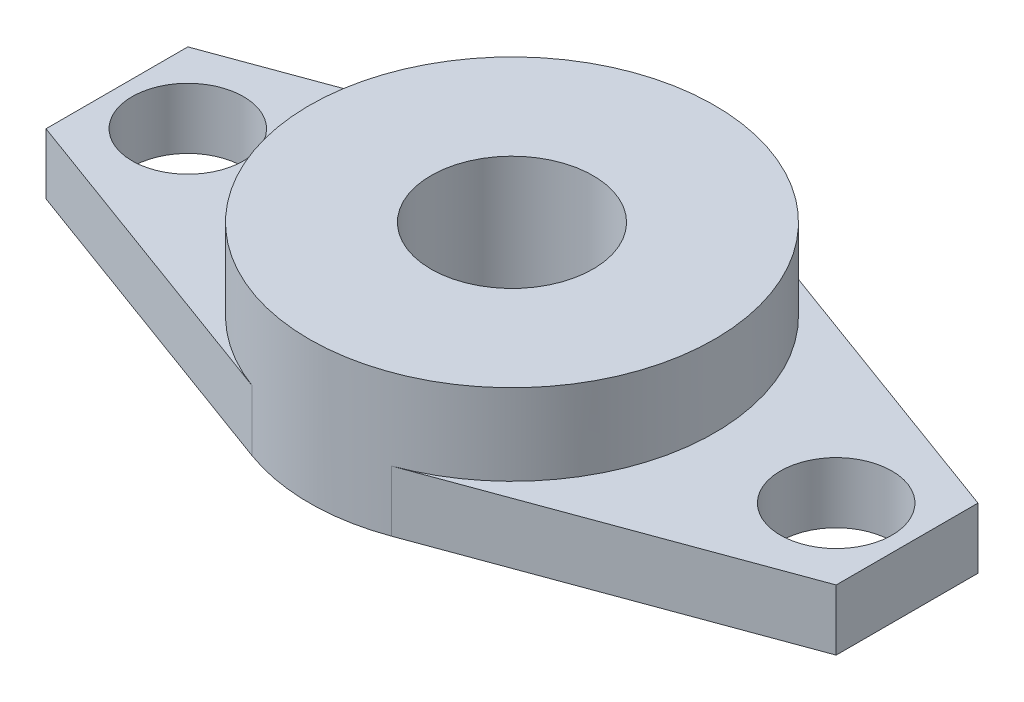
ISO-10303-21;
HEADER;
FILE_DESCRIPTION(('STEP AP214'),'2;1');
FILE_NAME('part.step','',(''),(''),'','','');
FILE_SCHEMA(('AUTOMOTIVE_DESIGN { 1 0 10303 214 1 1 1 1 }'));
ENDSEC;
DATA;
#1=APPLICATION_CONTEXT('core data for automotive mechanical design processes');
#2=APPLICATION_PROTOCOL_DEFINITION('international standard','automotive_design',2000,#1);
#3=PRODUCT_CONTEXT('',#1,'mechanical');
#4=PRODUCT('Part','Part','',(#3));
#5=PRODUCT_RELATED_PRODUCT_CATEGORY('part','',(#4));
#6=PRODUCT_DEFINITION_FORMATION('','',#4);
#7=PRODUCT_DEFINITION_CONTEXT('part definition',#1,'design');
#8=PRODUCT_DEFINITION('design','',#6,#7);
#9=PRODUCT_DEFINITION_SHAPE('','',#8);
#10=(LENGTH_UNIT() NAMED_UNIT(*) SI_UNIT(.MILLI.,.METRE.));
#11=(NAMED_UNIT(*) PLANE_ANGLE_UNIT() SI_UNIT($,.RADIAN.));
#12=(NAMED_UNIT(*) SI_UNIT($,.STERADIAN.) SOLID_ANGLE_UNIT());
#13=UNCERTAINTY_MEASURE_WITH_UNIT(LENGTH_MEASURE(1.E-05),#10,'distance_accuracy_value','');
#14=(GEOMETRIC_REPRESENTATION_CONTEXT(3) GLOBAL_UNCERTAINTY_ASSIGNED_CONTEXT((#13)) GLOBAL_UNIT_ASSIGNED_CONTEXT((#10,
#11,#12)) REPRESENTATION_CONTEXT('',''));
#15=CARTESIAN_POINT('',(0.,0.,0.));
#16=DIRECTION('',(0.,0.,1.));
#17=DIRECTION('',(1.,0.,0.));
#18=AXIS2_PLACEMENT_3D('',#15,#16,#17);
#19=CARTESIAN_POINT('',(0.,3.,0.));
#20=DIRECTION('',(0.,1.,0.));
#21=DIRECTION('',(0.,0.,1.));
#22=AXIS2_PLACEMENT_3D('',#19,#20,#21);
#23=PLANE('',#22);
#24=CARTESIAN_POINT('',(0.,3.,0.));
#25=DIRECTION('',(0.,1.,0.));
#26=DIRECTION('',(0.,0.,1.));
#27=AXIS2_PLACEMENT_3D('',#24,#25,#26);
#28=CIRCLE('',#27,10.);
#29=CARTESIAN_POINT('',(3.44307745687376,3.,9.38856845456046));
#30=VERTEX_POINT('',#29);
#31=CARTESIAN_POINT('',(3.44307745687376,3.,-9.38856845456046));
#32=VERTEX_POINT('',#31);
#33=EDGE_CURVE('E45',#30,#32,#28,.T.);
#34=ORIENTED_EDGE('',*,*,#33,.F.);
#35=DIRECTION('',(0.938856845456046,0.,-0.344307745687376));
#36=VECTOR('',#35,1.);
#37=CARTESIAN_POINT('',(19.5,3.,3.5));
#38=LINE('',#37,#36);
#39=CARTESIAN_POINT('',(19.5,3.,3.5));
#40=VERTEX_POINT('',#39);
#41=EDGE_CURVE('E175',#30,#40,#38,.T.);
#42=ORIENTED_EDGE('',*,*,#41,.T.);
#43=DIRECTION('',(0.,0.,-1.));
#44=VECTOR('',#43,1.);
#45=CARTESIAN_POINT('',(19.5,3.,-3.5));
#46=LINE('',#45,#44);
#47=CARTESIAN_POINT('',(19.5,3.,-3.5));
#48=VERTEX_POINT('',#47);
#49=EDGE_CURVE('E127',#40,#48,#46,.T.);
#50=ORIENTED_EDGE('',*,*,#49,.T.);
#51=DIRECTION('',(-0.938856845456046,0.,-0.344307745687376));
#52=VECTOR('',#51,1.);
#53=CARTESIAN_POINT('',(19.5,3.,-3.5));
#54=LINE('',#53,#52);
#55=EDGE_CURVE('E123',#48,#32,#54,.T.);
#56=ORIENTED_EDGE('',*,*,#55,.T.);
#57=EDGE_LOOP('',(#34,#42,#50,#56));
#58=FACE_BOUND('',#57,.T.);
#59=CARTESIAN_POINT('',(16.,3.,0.));
#60=DIRECTION('',(0.,1.,0.));
#61=DIRECTION('',(0.,0.,-1.));
#62=AXIS2_PLACEMENT_3D('',#59,#60,#61);
#63=CIRCLE('',#62,2.75);
#64=CARTESIAN_POINT('',(16.,3.,-2.75));
#65=VERTEX_POINT('',#64);
#66=EDGE_CURVE('E187',#65,#65,#63,.T.);
#67=ORIENTED_EDGE('',*,*,#66,.F.);
#68=EDGE_LOOP('',(#67));
#69=FACE_BOUND('',#68,.T.);
#70=ADVANCED_FACE('F34',(#58,#69),#23,.T.);
#71=CARTESIAN_POINT('',(-3.44307745687376,3.,-9.38856845456046));
#72=VERTEX_POINT('',#71);
#73=CARTESIAN_POINT('',(-3.44307745687376,3.,9.38856845456045));
#74=VERTEX_POINT('',#73);
#75=EDGE_CURVE('E11',#72,#74,#28,.T.);
#76=ORIENTED_EDGE('',*,*,#75,.F.);
#77=DIRECTION('',(-0.938856845456046,0.,0.344307745687376));
#78=VECTOR('',#77,1.);
#79=CARTESIAN_POINT('',(-19.5,3.,-3.5));
#80=LINE('',#79,#78);
#81=CARTESIAN_POINT('',(-19.5,3.,-3.5));
#82=VERTEX_POINT('',#81);
#83=EDGE_CURVE('E110',#72,#82,#80,.T.);
#84=ORIENTED_EDGE('',*,*,#83,.T.);
#85=DIRECTION('',(0.,0.,1.));
#86=VECTOR('',#85,1.);
#87=CARTESIAN_POINT('',(-19.5,3.,-3.5));
#88=LINE('',#87,#86);
#89=CARTESIAN_POINT('',(-19.5,3.,3.5));
#90=VERTEX_POINT('',#89);
#91=EDGE_CURVE('E53',#82,#90,#88,.T.);
#92=ORIENTED_EDGE('',*,*,#91,.T.);
#93=DIRECTION('',(0.938856845456046,0.,0.344307745687376));
#94=VECTOR('',#93,1.);
#95=CARTESIAN_POINT('',(-19.5,3.,3.5));
#96=LINE('',#95,#94);
#97=EDGE_CURVE('E95',#90,#74,#96,.T.);
#98=ORIENTED_EDGE('',*,*,#97,.T.);
#99=EDGE_LOOP('',(#76,#84,#92,#98));
#100=FACE_BOUND('',#99,.T.);
#101=CARTESIAN_POINT('',(-16.,3.,0.));
#102=DIRECTION('',(0.,1.,0.));
#103=DIRECTION('',(0.,0.,1.));
#104=AXIS2_PLACEMENT_3D('',#101,#102,#103);
#105=CIRCLE('',#104,2.75);
#106=CARTESIAN_POINT('',(-16.,3.,2.75));
#107=VERTEX_POINT('',#106);
#108=EDGE_CURVE('E135',#107,#107,#105,.T.);
#109=ORIENTED_EDGE('',*,*,#108,.F.);
#110=EDGE_LOOP('',(#109));
#111=FACE_BOUND('',#110,.T.);
#112=ADVANCED_FACE('F107',(#100,#111),#23,.T.);
#113=CARTESIAN_POINT('',(0.,0.,0.));
#114=DIRECTION('',(0.,1.,0.));
#115=DIRECTION('',(0.,0.,1.));
#116=AXIS2_PLACEMENT_3D('',#113,#114,#115);
#117=PLANE('',#116);
#118=DIRECTION('',(0.938856845456046,0.,0.344307745687376));
#119=VECTOR('',#118,1.);
#120=CARTESIAN_POINT('',(-19.5,0.,3.5));
#121=LINE('',#120,#119);
#122=CARTESIAN_POINT('',(-19.5,0.,3.5));
#123=VERTEX_POINT('',#122);
#124=CARTESIAN_POINT('',(-3.44307745687376,0.,9.38856845456045));
#125=VERTEX_POINT('',#124);
#126=EDGE_CURVE('E131',#123,#125,#121,.T.);
#127=ORIENTED_EDGE('',*,*,#126,.F.);
#128=DIRECTION('',(0.,0.,1.));
#129=VECTOR('',#128,1.);
#130=CARTESIAN_POINT('',(-19.5,0.,-3.5));
#131=LINE('',#130,#129);
#132=CARTESIAN_POINT('',(-19.5,0.,-3.5));
#133=VERTEX_POINT('',#132);
#134=EDGE_CURVE('E89',#133,#123,#131,.T.);
#135=ORIENTED_EDGE('',*,*,#134,.F.);
#136=DIRECTION('',(-0.938856845456046,0.,0.344307745687376));
#137=VECTOR('',#136,1.);
#138=CARTESIAN_POINT('',(-19.5,0.,-3.5));
#139=LINE('',#138,#137);
#140=CARTESIAN_POINT('',(-3.44307745687376,0.,-9.38856845456046));
#141=VERTEX_POINT('',#140);
#142=EDGE_CURVE('E83',#141,#133,#139,.T.);
#143=ORIENTED_EDGE('',*,*,#142,.F.);
#144=CARTESIAN_POINT('',(0.,0.,0.));
#145=DIRECTION('',(0.,1.,0.));
#146=DIRECTION('',(0.,0.,-1.));
#147=AXIS2_PLACEMENT_3D('',#144,#145,#146);
#148=CIRCLE('',#147,10.);
#149=CARTESIAN_POINT('',(3.44307745687376,0.,-9.38856845456046));
#150=VERTEX_POINT('',#149);
#151=EDGE_CURVE('E118',#150,#141,#148,.T.);
#152=ORIENTED_EDGE('',*,*,#151,.F.);
#153=DIRECTION('',(-0.938856845456046,0.,-0.344307745687376));
#154=VECTOR('',#153,1.);
#155=CARTESIAN_POINT('',(19.5,0.,-3.5));
#156=LINE('',#155,#154);
#157=CARTESIAN_POINT('',(19.5,0.,-3.5));
#158=VERTEX_POINT('',#157);
#159=EDGE_CURVE('E141',#158,#150,#156,.T.);
#160=ORIENTED_EDGE('',*,*,#159,.F.);
#161=DIRECTION('',(0.,0.,-1.));
#162=VECTOR('',#161,1.);
#163=CARTESIAN_POINT('',(19.5,0.,-3.5));
#164=LINE('',#163,#162);
#165=CARTESIAN_POINT('',(19.5,0.,3.5));
#166=VERTEX_POINT('',#165);
#167=EDGE_CURVE('E139',#166,#158,#164,.T.);
#168=ORIENTED_EDGE('',*,*,#167,.F.);
#169=DIRECTION('',(0.938856845456046,0.,-0.344307745687376));
#170=VECTOR('',#169,1.);
#171=CARTESIAN_POINT('',(19.5,0.,3.5));
#172=LINE('',#171,#170);
#173=CARTESIAN_POINT('',(3.44307745687376,0.,9.38856845456046));
#174=VERTEX_POINT('',#173);
#175=EDGE_CURVE('E137',#174,#166,#172,.T.);
#176=ORIENTED_EDGE('',*,*,#175,.F.);
#177=CARTESIAN_POINT('',(0.,0.,0.));
#178=DIRECTION('',(0.,1.,0.));
#179=DIRECTION('',(0.,0.,1.));
#180=AXIS2_PLACEMENT_3D('',#177,#178,#179);
#181=CIRCLE('',#180,10.);
#182=EDGE_CURVE('E134',#125,#174,#181,.T.);
#183=ORIENTED_EDGE('',*,*,#182,.F.);
#184=EDGE_LOOP('',(#127,#135,#143,#152,#160,#168,#176,#183));
#185=FACE_BOUND('',#184,.T.);
#186=CARTESIAN_POINT('',(-16.,0.,0.));
#187=DIRECTION('',(0.,1.,0.));
#188=DIRECTION('',(0.,0.,1.));
#189=AXIS2_PLACEMENT_3D('',#186,#187,#188);
#190=CIRCLE('',#189,2.75);
#191=CARTESIAN_POINT('',(-16.,0.,2.75));
#192=VERTEX_POINT('',#191);
#193=EDGE_CURVE('E179',#192,#192,#190,.T.);
#194=ORIENTED_EDGE('',*,*,#193,.T.);
#195=EDGE_LOOP('',(#194));
#196=FACE_BOUND('',#195,.T.);
#197=CARTESIAN_POINT('',(0.,0.,0.));
#198=DIRECTION('',(0.,1.,0.));
#199=DIRECTION('',(0.,0.,1.));
#200=AXIS2_PLACEMENT_3D('',#197,#198,#199);
#201=CIRCLE('',#200,4.);
#202=CARTESIAN_POINT('',(0.,0.,4.));
#203=VERTEX_POINT('',#202);
#204=EDGE_CURVE('E182',#203,#203,#201,.T.);
#205=ORIENTED_EDGE('',*,*,#204,.T.);
#206=EDGE_LOOP('',(#205));
#207=FACE_BOUND('',#206,.T.);
#208=CARTESIAN_POINT('',(16.,0.,0.));
#209=DIRECTION('',(0.,1.,0.));
#210=DIRECTION('',(0.,0.,-1.));
#211=AXIS2_PLACEMENT_3D('',#208,#209,#210);
#212=CIRCLE('',#211,2.75);
#213=CARTESIAN_POINT('',(16.,0.,-2.75));
#214=VERTEX_POINT('',#213);
#215=EDGE_CURVE('E188',#214,#214,#212,.T.);
#216=ORIENTED_EDGE('',*,*,#215,.T.);
#217=EDGE_LOOP('',(#216));
#218=FACE_BOUND('',#217,.T.);
#219=ADVANCED_FACE('F163',(#185,#196,#207,#218),#117,.F.);
#220=CARTESIAN_POINT('',(-19.5,3.,3.5));
#221=DIRECTION('',(0.344307745687376,0.,-0.938856845456046));
#222=DIRECTION('',(-0.938856845456046,0.,-0.344307745687376));
#223=AXIS2_PLACEMENT_3D('',#220,#221,#222);
#224=PLANE('',#223);
#225=ORIENTED_EDGE('',*,*,#126,.T.);
#226=DIRECTION('',(0.,-1.,0.));
#227=VECTOR('',#226,1.);
#228=CARTESIAN_POINT('',(-3.44307745687376,3.,9.38856845456045));
#229=LINE('',#228,#227);
#230=EDGE_CURVE('E38',#74,#125,#229,.T.);
#231=ORIENTED_EDGE('',*,*,#230,.F.);
#232=ORIENTED_EDGE('',*,*,#97,.F.);
#233=DIRECTION('',(0.,-1.,0.));
#234=VECTOR('',#233,1.);
#235=CARTESIAN_POINT('',(-19.5,3.,3.5));
#236=LINE('',#235,#234);
#237=EDGE_CURVE('E125',#90,#123,#236,.T.);
#238=ORIENTED_EDGE('',*,*,#237,.T.);
#239=EDGE_LOOP('',(#225,#231,#232,#238));
#240=FACE_BOUND('',#239,.T.);
#241=ADVANCED_FACE('F36',(#240),#224,.F.);
#242=CARTESIAN_POINT('',(19.5,3.,3.5));
#243=DIRECTION('',(-0.344307745687376,0.,-0.938856845456046));
#244=DIRECTION('',(-0.938856845456046,0.,0.344307745687376));
#245=AXIS2_PLACEMENT_3D('',#242,#243,#244);
#246=PLANE('',#245);
#247=ORIENTED_EDGE('',*,*,#175,.T.);
#248=DIRECTION('',(0.,-1.,0.));
#249=VECTOR('',#248,1.);
#250=CARTESIAN_POINT('',(19.5,3.,3.5));
#251=LINE('',#250,#249);
#252=EDGE_CURVE('E152',#40,#166,#251,.T.);
#253=ORIENTED_EDGE('',*,*,#252,.F.);
#254=ORIENTED_EDGE('',*,*,#41,.F.);
#255=DIRECTION('',(0.,-1.,0.));
#256=VECTOR('',#255,1.);
#257=CARTESIAN_POINT('',(3.44307745687376,3.,9.38856845456046));
#258=LINE('',#257,#256);
#259=EDGE_CURVE('E154',#30,#174,#258,.T.);
#260=ORIENTED_EDGE('',*,*,#259,.T.);
#261=EDGE_LOOP('',(#247,#253,#254,#260));
#262=FACE_BOUND('',#261,.T.);
#263=ADVANCED_FACE('F168',(#262),#246,.F.);
#264=CARTESIAN_POINT('',(19.5,3.,-3.5));
#265=DIRECTION('',(-1.,0.,0.));
#266=DIRECTION('',(0.,0.,1.));
#267=AXIS2_PLACEMENT_3D('',#264,#265,#266);
#268=PLANE('',#267);
#269=ORIENTED_EDGE('',*,*,#167,.T.);
#270=DIRECTION('',(0.,-1.,0.));
#271=VECTOR('',#270,1.);
#272=CARTESIAN_POINT('',(19.5,3.,-3.5));
#273=LINE('',#272,#271);
#274=EDGE_CURVE('E149',#48,#158,#273,.T.);
#275=ORIENTED_EDGE('',*,*,#274,.F.);
#276=ORIENTED_EDGE('',*,*,#49,.F.);
#277=ORIENTED_EDGE('',*,*,#252,.T.);
#278=EDGE_LOOP('',(#269,#275,#276,#277));
#279=FACE_BOUND('',#278,.T.);
#280=ADVANCED_FACE('F171',(#279),#268,.F.);
#281=CARTESIAN_POINT('',(19.5,3.,-3.5));
#282=DIRECTION('',(-0.344307745687376,0.,0.938856845456046));
#283=DIRECTION('',(0.938856845456046,0.,0.344307745687376));
#284=AXIS2_PLACEMENT_3D('',#281,#282,#283);
#285=PLANE('',#284);
#286=ORIENTED_EDGE('',*,*,#159,.T.);
#287=DIRECTION('',(0.,-1.,0.));
#288=VECTOR('',#287,1.);
#289=CARTESIAN_POINT('',(3.44307745687376,3.,-9.38856845456046));
#290=LINE('',#289,#288);
#291=EDGE_CURVE('E119',#32,#150,#290,.T.);
#292=ORIENTED_EDGE('',*,*,#291,.F.);
#293=ORIENTED_EDGE('',*,*,#55,.F.);
#294=ORIENTED_EDGE('',*,*,#274,.T.);
#295=EDGE_LOOP('',(#286,#292,#293,#294));
#296=FACE_BOUND('',#295,.T.);
#297=ADVANCED_FACE('F233',(#296),#285,.F.);
#298=CARTESIAN_POINT('',(0.,3.,0.));
#299=DIRECTION('',(0.,-1.,0.));
#300=DIRECTION('',(0.,0.,-1.));
#301=AXIS2_PLACEMENT_3D('',#298,#299,#300);
#302=CYLINDRICAL_SURFACE('',#301,10.);
#303=ORIENTED_EDGE('',*,*,#151,.T.);
#304=DIRECTION('',(0.,-1.,0.));
#305=VECTOR('',#304,1.);
#306=CARTESIAN_POINT('',(-3.44307745687376,3.,-9.38856845456046));
#307=LINE('',#306,#305);
#308=EDGE_CURVE('E113',#72,#141,#307,.T.);
#309=ORIENTED_EDGE('',*,*,#308,.F.);
#310=ORIENTED_EDGE('',*,*,#75,.T.);
#311=ORIENTED_EDGE('',*,*,#230,.T.);
#312=ORIENTED_EDGE('',*,*,#182,.T.);
#313=ORIENTED_EDGE('',*,*,#259,.F.);
#314=ORIENTED_EDGE('',*,*,#33,.T.);
#315=ORIENTED_EDGE('',*,*,#291,.T.);
#316=EDGE_LOOP('',(#303,#309,#310,#311,#312,#313,#314,#315));
#317=FACE_BOUND('',#316,.T.);
#318=CARTESIAN_POINT('',(0.,7.,0.));
#319=DIRECTION('',(0.,1.,0.));
#320=DIRECTION('',(0.,0.,1.));
#321=AXIS2_PLACEMENT_3D('',#318,#319,#320);
#322=CIRCLE('',#321,10.);
#323=CARTESIAN_POINT('',(0.,7.,10.));
#324=VERTEX_POINT('',#323);
#325=EDGE_CURVE('E191',#324,#324,#322,.T.);
#326=ORIENTED_EDGE('',*,*,#325,.F.);
#327=EDGE_LOOP('',(#326));
#328=FACE_BOUND('',#327,.T.);
#329=ADVANCED_FACE('F114',(#317,#328),#302,.T.);
#330=CARTESIAN_POINT('',(-19.5,3.,-3.5));
#331=DIRECTION('',(0.344307745687376,0.,0.938856845456046));
#332=DIRECTION('',(0.938856845456046,0.,-0.344307745687376));
#333=AXIS2_PLACEMENT_3D('',#330,#331,#332);
#334=PLANE('',#333);
#335=ORIENTED_EDGE('',*,*,#142,.T.);
#336=DIRECTION('',(0.,-1.,0.));
#337=VECTOR('',#336,1.);
#338=CARTESIAN_POINT('',(-19.5,3.,-3.5));
#339=LINE('',#338,#337);
#340=EDGE_CURVE('E120',#82,#133,#339,.T.);
#341=ORIENTED_EDGE('',*,*,#340,.F.);
#342=ORIENTED_EDGE('',*,*,#83,.F.);
#343=ORIENTED_EDGE('',*,*,#308,.T.);
#344=EDGE_LOOP('',(#335,#341,#342,#343));
#345=FACE_BOUND('',#344,.T.);
#346=ADVANCED_FACE('F122',(#345),#334,.F.);
#347=CARTESIAN_POINT('',(-19.5,3.,-3.5));
#348=DIRECTION('',(1.,0.,0.));
#349=DIRECTION('',(0.,0.,-1.));
#350=AXIS2_PLACEMENT_3D('',#347,#348,#349);
#351=PLANE('',#350);
#352=ORIENTED_EDGE('',*,*,#134,.T.);
#353=ORIENTED_EDGE('',*,*,#237,.F.);
#354=ORIENTED_EDGE('',*,*,#91,.F.);
#355=ORIENTED_EDGE('',*,*,#340,.T.);
#356=EDGE_LOOP('',(#352,#353,#354,#355));
#357=FACE_BOUND('',#356,.T.);
#358=ADVANCED_FACE('F226',(#357),#351,.F.);
#359=CARTESIAN_POINT('',(-16.,3.,0.));
#360=DIRECTION('',(0.,-1.,0.));
#361=DIRECTION('',(0.,0.,-1.));
#362=AXIS2_PLACEMENT_3D('',#359,#360,#361);
#363=CYLINDRICAL_SURFACE('',#362,2.75);
#364=ORIENTED_EDGE('',*,*,#108,.T.);
#365=EDGE_LOOP('',(#364));
#366=FACE_BOUND('',#365,.T.);
#367=ORIENTED_EDGE('',*,*,#193,.F.);
#368=EDGE_LOOP('',(#367));
#369=FACE_BOUND('',#368,.T.);
#370=ADVANCED_FACE('F222',(#366,#369),#363,.F.);
#371=CARTESIAN_POINT('',(0.,3.,0.));
#372=DIRECTION('',(0.,-1.,0.));
#373=DIRECTION('',(0.,0.,-1.));
#374=AXIS2_PLACEMENT_3D('',#371,#372,#373);
#375=CYLINDRICAL_SURFACE('',#374,4.);
#376=ORIENTED_EDGE('',*,*,#204,.F.);
#377=EDGE_LOOP('',(#376));
#378=FACE_BOUND('',#377,.T.);
#379=CARTESIAN_POINT('',(0.,7.,0.));
#380=DIRECTION('',(0.,1.,0.));
#381=DIRECTION('',(0.,0.,1.));
#382=AXIS2_PLACEMENT_3D('',#379,#380,#381);
#383=CIRCLE('',#382,4.);
#384=CARTESIAN_POINT('',(0.,7.,4.));
#385=VERTEX_POINT('',#384);
#386=EDGE_CURVE('E195',#385,#385,#383,.T.);
#387=ORIENTED_EDGE('',*,*,#386,.T.);
#388=EDGE_LOOP('',(#387));
#389=FACE_BOUND('',#388,.T.);
#390=ADVANCED_FACE('F201',(#378,#389),#375,.F.);
#391=CARTESIAN_POINT('',(16.,3.,0.));
#392=DIRECTION('',(0.,-1.,0.));
#393=DIRECTION('',(0.,0.,-1.));
#394=AXIS2_PLACEMENT_3D('',#391,#392,#393);
#395=CYLINDRICAL_SURFACE('',#394,2.75);
#396=ORIENTED_EDGE('',*,*,#66,.T.);
#397=EDGE_LOOP('',(#396));
#398=FACE_BOUND('',#397,.T.);
#399=ORIENTED_EDGE('',*,*,#215,.F.);
#400=EDGE_LOOP('',(#399));
#401=FACE_BOUND('',#400,.T.);
#402=ADVANCED_FACE('F205',(#398,#401),#395,.F.);
#403=CARTESIAN_POINT('',(0.,7.,0.));
#404=DIRECTION('',(0.,1.,0.));
#405=DIRECTION('',(0.,0.,1.));
#406=AXIS2_PLACEMENT_3D('',#403,#404,#405);
#407=PLANE('',#406);
#408=ORIENTED_EDGE('',*,*,#325,.T.);
#409=EDGE_LOOP('',(#408));
#410=FACE_BOUND('',#409,.T.);
#411=ORIENTED_EDGE('',*,*,#386,.F.);
#412=EDGE_LOOP('',(#411));
#413=FACE_BOUND('',#412,.T.);
#414=ADVANCED_FACE('F203',(#410,#413),#407,.T.);
#415=CLOSED_SHELL('',(#70,#112,#219,#241,#263,#280,#297,#329,#346,#358,#370,#390,#402,#414));
#416=MANIFOLD_SOLID_BREP('B2',#415);
#417=ADVANCED_BREP_SHAPE_REPRESENTATION('',(#18,#416),#14);
#418=SHAPE_DEFINITION_REPRESENTATION(#9,#417);
ENDSEC;
END-ISO-10303-21;
